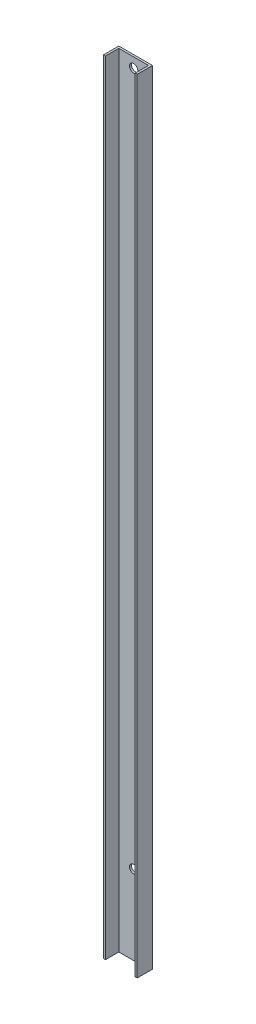
ISO-10303-21;
HEADER;
FILE_DESCRIPTION(('STEP AP214'),'2;1');
FILE_NAME('part.step','',(''),(''),'','','');
FILE_SCHEMA(('AUTOMOTIVE_DESIGN { 1 0 10303 214 1 1 1 1 }'));
ENDSEC;
DATA;
#1=APPLICATION_CONTEXT('core data for automotive mechanical design processes');
#2=APPLICATION_PROTOCOL_DEFINITION('international standard','automotive_design',2000,#1);
#3=PRODUCT_CONTEXT('',#1,'mechanical');
#4=PRODUCT('Part','Part','',(#3));
#5=PRODUCT_RELATED_PRODUCT_CATEGORY('part','',(#4));
#6=PRODUCT_DEFINITION_FORMATION('','',#4);
#7=PRODUCT_DEFINITION_CONTEXT('part definition',#1,'design');
#8=PRODUCT_DEFINITION('design','',#6,#7);
#9=PRODUCT_DEFINITION_SHAPE('','',#8);
#10=(LENGTH_UNIT() NAMED_UNIT(*) SI_UNIT(.MILLI.,.METRE.));
#11=(NAMED_UNIT(*) PLANE_ANGLE_UNIT() SI_UNIT($,.RADIAN.));
#12=(NAMED_UNIT(*) SI_UNIT($,.STERADIAN.) SOLID_ANGLE_UNIT());
#13=UNCERTAINTY_MEASURE_WITH_UNIT(LENGTH_MEASURE(1.E-05),#10,'distance_accuracy_value','');
#14=(GEOMETRIC_REPRESENTATION_CONTEXT(3) GLOBAL_UNCERTAINTY_ASSIGNED_CONTEXT((#13)) GLOBAL_UNIT_ASSIGNED_CONTEXT((#10,
#11,#12)) REPRESENTATION_CONTEXT('',''));
#15=CARTESIAN_POINT('',(0.,0.,0.));
#16=DIRECTION('',(0.,0.,1.));
#17=DIRECTION('',(1.,0.,0.));
#18=AXIS2_PLACEMENT_3D('',#15,#16,#17);
#19=CARTESIAN_POINT('',(5.05454545454545,430.,-7.7));
#20=DIRECTION('',(1.,0.,0.));
#21=DIRECTION('',(0.,0.,-1.));
#22=AXIS2_PLACEMENT_3D('',#19,#20,#21);
#23=PLANE('',#22);
#24=DIRECTION('',(0.,-1.,0.));
#25=VECTOR('',#24,1.);
#26=CARTESIAN_POINT('',(5.05454545454545,430.,0.));
#27=LINE('',#26,#25);
#28=CARTESIAN_POINT('',(5.05454545454545,395.,0.));
#29=VERTEX_POINT('',#28);
#30=CARTESIAN_POINT('',(5.05454545454545,0.,0.));
#31=VERTEX_POINT('',#30);
#32=EDGE_CURVE('E40',#29,#31,#27,.T.);
#33=ORIENTED_EDGE('',*,*,#32,.F.);
#34=DIRECTION('',(0.,0.,-1.));
#35=VECTOR('',#34,1.);
#36=CARTESIAN_POINT('',(5.05454545454545,395.,-7.7));
#37=LINE('',#36,#35);
#38=CARTESIAN_POINT('',(5.05454545454545,395.,-6.7));
#39=VERTEX_POINT('',#38);
#40=EDGE_CURVE('E105',#29,#39,#37,.T.);
#41=ORIENTED_EDGE('',*,*,#40,.T.);
#42=DIRECTION('',(0.,-1.,0.));
#43=VECTOR('',#42,1.);
#44=CARTESIAN_POINT('',(5.05454545454545,430.,-6.7));
#45=LINE('',#44,#43);
#46=CARTESIAN_POINT('',(5.05454545454545,0.,-6.7));
#47=VERTEX_POINT('',#46);
#48=EDGE_CURVE('E54',#39,#47,#45,.T.);
#49=ORIENTED_EDGE('',*,*,#48,.T.);
#50=DIRECTION('',(0.,0.,1.));
#51=VECTOR('',#50,1.);
#52=CARTESIAN_POINT('',(5.05454545454545,0.,-7.7));
#53=LINE('',#52,#51);
#54=EDGE_CURVE('E140',#47,#31,#53,.T.);
#55=ORIENTED_EDGE('',*,*,#54,.T.);
#56=EDGE_LOOP('',(#33,#41,#49,#55));
#57=FACE_BOUND('',#56,.T.);
#58=ADVANCED_FACE('F33',(#57),#23,.F.);
#59=CARTESIAN_POINT('',(6.05454545454545,430.,0.));
#60=DIRECTION('',(0.,0.,1.));
#61=DIRECTION('',(1.,0.,0.));
#62=AXIS2_PLACEMENT_3D('',#59,#60,#61);
#63=PLANE('',#62);
#64=DIRECTION('',(1.,0.,0.));
#65=VECTOR('',#64,1.);
#66=CARTESIAN_POINT('',(-18.7930909777879,395.,0.));
#67=LINE('',#66,#65);
#68=CARTESIAN_POINT('',(6.05454545454545,395.,0.));
#69=VERTEX_POINT('',#68);
#70=EDGE_CURVE('E114',#29,#69,#67,.T.);
#71=ORIENTED_EDGE('',*,*,#70,.F.);
#72=ORIENTED_EDGE('',*,*,#32,.T.);
#73=DIRECTION('',(-1.,0.,0.));
#74=VECTOR('',#73,1.);
#75=CARTESIAN_POINT('',(6.05454545454545,0.,0.));
#76=LINE('',#75,#74);
#77=CARTESIAN_POINT('',(6.05454545454545,0.,0.));
#78=VERTEX_POINT('',#77);
#79=EDGE_CURVE('E137',#78,#31,#76,.T.);
#80=ORIENTED_EDGE('',*,*,#79,.F.);
#81=DIRECTION('',(0.,-1.,0.));
#82=VECTOR('',#81,1.);
#83=CARTESIAN_POINT('',(6.05454545454545,430.,0.));
#84=LINE('',#83,#82);
#85=EDGE_CURVE('E129',#69,#78,#84,.T.);
#86=ORIENTED_EDGE('',*,*,#85,.F.);
#87=EDGE_LOOP('',(#71,#72,#80,#86));
#88=FACE_BOUND('',#87,.T.);
#89=ADVANCED_FACE('F134',(#88),#63,.T.);
#90=CARTESIAN_POINT('',(6.05454545454545,430.,-7.7));
#91=DIRECTION('',(1.,0.,0.));
#92=DIRECTION('',(0.,0.,-1.));
#93=AXIS2_PLACEMENT_3D('',#90,#91,#92);
#94=PLANE('',#93);
#95=DIRECTION('',(0.,0.,-1.));
#96=VECTOR('',#95,1.);
#97=CARTESIAN_POINT('',(6.05454545454545,395.,-7.7));
#98=LINE('',#97,#96);
#99=CARTESIAN_POINT('',(6.05454545454545,395.,-7.7));
#100=VERTEX_POINT('',#99);
#101=EDGE_CURVE('E177',#69,#100,#98,.T.);
#102=ORIENTED_EDGE('',*,*,#101,.F.);
#103=ORIENTED_EDGE('',*,*,#85,.T.);
#104=DIRECTION('',(0.,0.,1.));
#105=VECTOR('',#104,1.);
#106=CARTESIAN_POINT('',(6.05454545454545,0.,-7.7));
#107=LINE('',#106,#105);
#108=CARTESIAN_POINT('',(6.05454545454545,0.,-7.7));
#109=VERTEX_POINT('',#108);
#110=EDGE_CURVE('E148',#109,#78,#107,.T.);
#111=ORIENTED_EDGE('',*,*,#110,.F.);
#112=DIRECTION('',(0.,-1.,0.));
#113=VECTOR('',#112,1.);
#114=CARTESIAN_POINT('',(6.05454545454545,430.,-7.7));
#115=LINE('',#114,#113);
#116=EDGE_CURVE('E122',#100,#109,#115,.T.);
#117=ORIENTED_EDGE('',*,*,#116,.F.);
#118=EDGE_LOOP('',(#102,#103,#111,#117));
#119=FACE_BOUND('',#118,.T.);
#120=ADVANCED_FACE('F176',(#119),#94,.T.);
#121=CARTESIAN_POINT('',(-10.9454545454545,430.,-7.7));
#122=DIRECTION('',(0.,0.,-1.));
#123=DIRECTION('',(-1.,0.,0.));
#124=AXIS2_PLACEMENT_3D('',#121,#122,#123);
#125=PLANE('',#124);
#126=DIRECTION('',(-1.,0.,0.));
#127=VECTOR('',#126,1.);
#128=CARTESIAN_POINT('',(-10.9454545454545,395.,-7.7));
#129=LINE('',#128,#127);
#130=CARTESIAN_POINT('',(-10.9454545454545,395.,-7.7));
#131=VERTEX_POINT('',#130);
#132=EDGE_CURVE('E101',#100,#131,#129,.T.);
#133=ORIENTED_EDGE('',*,*,#132,.F.);
#134=ORIENTED_EDGE('',*,*,#116,.T.);
#135=DIRECTION('',(1.,0.,0.));
#136=VECTOR('',#135,1.);
#137=CARTESIAN_POINT('',(-10.9454545454545,0.,-7.7));
#138=LINE('',#137,#136);
#139=CARTESIAN_POINT('',(-10.9454545454545,0.,-7.7));
#140=VERTEX_POINT('',#139);
#141=EDGE_CURVE('E150',#140,#109,#138,.T.);
#142=ORIENTED_EDGE('',*,*,#141,.F.);
#143=DIRECTION('',(0.,-1.,0.));
#144=VECTOR('',#143,1.);
#145=CARTESIAN_POINT('',(-10.9454545454545,430.,-7.7));
#146=LINE('',#145,#144);
#147=EDGE_CURVE('E120',#131,#140,#146,.T.);
#148=ORIENTED_EDGE('',*,*,#147,.F.);
#149=EDGE_LOOP('',(#133,#134,#142,#148));
#150=FACE_BOUND('',#149,.T.);
#151=CARTESIAN_POINT('',(-2.44545454545446,39.9999999999999,-7.7));
#152=DIRECTION('',(0.,0.,-1.));
#153=DIRECTION('',(-1.,0.,0.));
#154=AXIS2_PLACEMENT_3D('',#151,#152,#153);
#155=CIRCLE('',#154,2.1);
#156=CARTESIAN_POINT('',(-4.54545454545446,39.9999999999999,-7.7));
#157=VERTEX_POINT('',#156);
#158=EDGE_CURVE('E181',#157,#157,#155,.T.);
#159=ORIENTED_EDGE('',*,*,#158,.F.);
#160=EDGE_LOOP('',(#159));
#161=FACE_BOUND('',#160,.T.);
#162=CARTESIAN_POINT('',(-2.44545454545455,390.,-7.7));
#163=DIRECTION('',(0.,0.,-1.));
#164=DIRECTION('',(-1.,0.,0.));
#165=AXIS2_PLACEMENT_3D('',#162,#163,#164);
#166=CIRCLE('',#165,2.1);
#167=CARTESIAN_POINT('',(-4.54545454545455,390.,-7.7));
#168=VERTEX_POINT('',#167);
#169=EDGE_CURVE('E143',#168,#168,#166,.T.);
#170=ORIENTED_EDGE('',*,*,#169,.F.);
#171=EDGE_LOOP('',(#170));
#172=FACE_BOUND('',#171,.T.);
#173=ADVANCED_FACE('F171',(#150,#161,#172),#125,.T.);
#174=CARTESIAN_POINT('',(-10.9454545454545,430.,0.));
#175=DIRECTION('',(-1.,0.,0.));
#176=DIRECTION('',(0.,0.,1.));
#177=AXIS2_PLACEMENT_3D('',#174,#175,#176);
#178=PLANE('',#177);
#179=DIRECTION('',(0.,0.,1.));
#180=VECTOR('',#179,1.);
#181=CARTESIAN_POINT('',(-10.9454545454545,395.,0.));
#182=LINE('',#181,#180);
#183=CARTESIAN_POINT('',(-10.9454545454545,395.,0.));
#184=VERTEX_POINT('',#183);
#185=EDGE_CURVE('E96',#131,#184,#182,.T.);
#186=ORIENTED_EDGE('',*,*,#185,.F.);
#187=ORIENTED_EDGE('',*,*,#147,.T.);
#188=DIRECTION('',(0.,0.,-1.));
#189=VECTOR('',#188,1.);
#190=CARTESIAN_POINT('',(-10.9454545454545,0.,0.));
#191=LINE('',#190,#189);
#192=CARTESIAN_POINT('',(-10.9454545454545,0.,0.));
#193=VERTEX_POINT('',#192);
#194=EDGE_CURVE('E118',#193,#140,#191,.T.);
#195=ORIENTED_EDGE('',*,*,#194,.F.);
#196=DIRECTION('',(0.,-1.,0.));
#197=VECTOR('',#196,1.);
#198=CARTESIAN_POINT('',(-10.9454545454545,430.,0.));
#199=LINE('',#198,#197);
#200=EDGE_CURVE('E111',#184,#193,#199,.T.);
#201=ORIENTED_EDGE('',*,*,#200,.F.);
#202=EDGE_LOOP('',(#186,#187,#195,#201));
#203=FACE_BOUND('',#202,.T.);
#204=ADVANCED_FACE('F116',(#203),#178,.T.);
#205=CARTESIAN_POINT('',(-9.94545454545455,430.,0.));
#206=DIRECTION('',(0.,0.,1.));
#207=DIRECTION('',(1.,0.,0.));
#208=AXIS2_PLACEMENT_3D('',#205,#206,#207);
#209=PLANE('',#208);
#210=CARTESIAN_POINT('',(-9.94545454545455,395.,0.));
#211=VERTEX_POINT('',#210);
#212=EDGE_CURVE('E99',#184,#211,#67,.T.);
#213=ORIENTED_EDGE('',*,*,#212,.F.);
#214=ORIENTED_EDGE('',*,*,#200,.T.);
#215=DIRECTION('',(-1.,0.,0.));
#216=VECTOR('',#215,1.);
#217=CARTESIAN_POINT('',(-9.94545454545455,0.,0.));
#218=LINE('',#217,#216);
#219=CARTESIAN_POINT('',(-9.94545454545455,0.,0.));
#220=VERTEX_POINT('',#219);
#221=EDGE_CURVE('E156',#220,#193,#218,.T.);
#222=ORIENTED_EDGE('',*,*,#221,.F.);
#223=DIRECTION('',(0.,-1.,0.));
#224=VECTOR('',#223,1.);
#225=CARTESIAN_POINT('',(-9.94545454545455,430.,0.));
#226=LINE('',#225,#224);
#227=EDGE_CURVE('E113',#211,#220,#226,.T.);
#228=ORIENTED_EDGE('',*,*,#227,.F.);
#229=EDGE_LOOP('',(#213,#214,#222,#228));
#230=FACE_BOUND('',#229,.T.);
#231=ADVANCED_FACE('F109',(#230),#209,.T.);
#232=CARTESIAN_POINT('',(-9.94545454545455,430.,0.));
#233=DIRECTION('',(-1.,0.,0.));
#234=DIRECTION('',(0.,0.,1.));
#235=AXIS2_PLACEMENT_3D('',#232,#233,#234);
#236=PLANE('',#235);
#237=DIRECTION('',(0.,-1.,0.));
#238=VECTOR('',#237,1.);
#239=CARTESIAN_POINT('',(-9.94545454545455,430.,-6.7));
#240=LINE('',#239,#238);
#241=CARTESIAN_POINT('',(-9.94545454545455,395.,-6.7));
#242=VERTEX_POINT('',#241);
#243=CARTESIAN_POINT('',(-9.94545454545455,0.,-6.7));
#244=VERTEX_POINT('',#243);
#245=EDGE_CURVE('E124',#242,#244,#240,.T.);
#246=ORIENTED_EDGE('',*,*,#245,.F.);
#247=DIRECTION('',(0.,0.,1.));
#248=VECTOR('',#247,1.);
#249=CARTESIAN_POINT('',(-9.94545454545455,395.,0.));
#250=LINE('',#249,#248);
#251=EDGE_CURVE('E47',#242,#211,#250,.T.);
#252=ORIENTED_EDGE('',*,*,#251,.T.);
#253=ORIENTED_EDGE('',*,*,#227,.T.);
#254=DIRECTION('',(0.,0.,-1.));
#255=VECTOR('',#254,1.);
#256=CARTESIAN_POINT('',(-9.94545454545455,0.,0.));
#257=LINE('',#256,#255);
#258=EDGE_CURVE('E158',#220,#244,#257,.T.);
#259=ORIENTED_EDGE('',*,*,#258,.T.);
#260=EDGE_LOOP('',(#246,#252,#253,#259));
#261=FACE_BOUND('',#260,.T.);
#262=ADVANCED_FACE('F168',(#261),#236,.F.);
#263=CARTESIAN_POINT('',(-10.9454545454545,430.,-6.7));
#264=DIRECTION('',(0.,0.,-1.));
#265=DIRECTION('',(-1.,0.,0.));
#266=AXIS2_PLACEMENT_3D('',#263,#264,#265);
#267=PLANE('',#266);
#268=CARTESIAN_POINT('',(-2.44545454545446,39.9999999999999,-6.7));
#269=DIRECTION('',(0.,0.,1.));
#270=DIRECTION('',(-1.,0.,0.));
#271=AXIS2_PLACEMENT_3D('',#268,#269,#270);
#272=CIRCLE('',#271,2.1);
#273=CARTESIAN_POINT('',(-4.54545454545446,39.9999999999999,-6.7));
#274=VERTEX_POINT('',#273);
#275=EDGE_CURVE('E178',#274,#274,#272,.T.);
#276=ORIENTED_EDGE('',*,*,#275,.F.);
#277=EDGE_LOOP('',(#276));
#278=FACE_BOUND('',#277,.T.);
#279=CARTESIAN_POINT('',(-2.44545454545455,390.,-6.7));
#280=DIRECTION('',(0.,0.,1.));
#281=DIRECTION('',(1.,0.,0.));
#282=AXIS2_PLACEMENT_3D('',#279,#280,#281);
#283=CIRCLE('',#282,2.1);
#284=CARTESIAN_POINT('',(-0.345454545454551,390.,-6.7));
#285=VERTEX_POINT('',#284);
#286=EDGE_CURVE('E187',#285,#285,#283,.T.);
#287=ORIENTED_EDGE('',*,*,#286,.F.);
#288=EDGE_LOOP('',(#287));
#289=FACE_BOUND('',#288,.T.);
#290=ORIENTED_EDGE('',*,*,#48,.F.);
#291=DIRECTION('',(-1.,0.,0.));
#292=VECTOR('',#291,1.);
#293=CARTESIAN_POINT('',(-10.9454545454545,395.,-6.7));
#294=LINE('',#293,#292);
#295=EDGE_CURVE('E11',#39,#242,#294,.T.);
#296=ORIENTED_EDGE('',*,*,#295,.T.);
#297=ORIENTED_EDGE('',*,*,#245,.T.);
#298=DIRECTION('',(1.,0.,0.));
#299=VECTOR('',#298,1.);
#300=CARTESIAN_POINT('',(-10.9454545454545,0.,-6.7));
#301=LINE('',#300,#299);
#302=EDGE_CURVE('E161',#244,#47,#301,.T.);
#303=ORIENTED_EDGE('',*,*,#302,.T.);
#304=EDGE_LOOP('',(#290,#296,#297,#303));
#305=FACE_BOUND('',#304,.T.);
#306=ADVANCED_FACE('F165',(#278,#289,#305),#267,.F.);
#307=CARTESIAN_POINT('',(0.,0.,0.));
#308=DIRECTION('',(0.,-1.,0.));
#309=DIRECTION('',(-1.,0.,0.));
#310=AXIS2_PLACEMENT_3D('',#307,#308,#309);
#311=PLANE('',#310);
#312=ORIENTED_EDGE('',*,*,#54,.F.);
#313=ORIENTED_EDGE('',*,*,#302,.F.);
#314=ORIENTED_EDGE('',*,*,#258,.F.);
#315=ORIENTED_EDGE('',*,*,#221,.T.);
#316=ORIENTED_EDGE('',*,*,#194,.T.);
#317=ORIENTED_EDGE('',*,*,#141,.T.);
#318=ORIENTED_EDGE('',*,*,#110,.T.);
#319=ORIENTED_EDGE('',*,*,#79,.T.);
#320=EDGE_LOOP('',(#312,#313,#314,#315,#316,#317,#318,#319));
#321=FACE_BOUND('',#320,.T.);
#322=ADVANCED_FACE('F145',(#321),#311,.T.);
#323=CARTESIAN_POINT('',(-2.44545454545455,390.,-16.7));
#324=DIRECTION('',(0.,0.,1.));
#325=DIRECTION('',(1.,0.,0.));
#326=AXIS2_PLACEMENT_3D('',#323,#324,#325);
#327=CYLINDRICAL_SURFACE('',#326,2.1);
#328=ORIENTED_EDGE('',*,*,#169,.T.);
#329=EDGE_LOOP('',(#328));
#330=FACE_BOUND('',#329,.T.);
#331=ORIENTED_EDGE('',*,*,#286,.T.);
#332=EDGE_LOOP('',(#331));
#333=FACE_BOUND('',#332,.T.);
#334=ADVANCED_FACE('F192',(#330,#333),#327,.F.);
#335=CARTESIAN_POINT('',(-2.44545454545446,39.9999999999999,-16.7));
#336=DIRECTION('',(0.,0.,1.));
#337=DIRECTION('',(1.,0.,0.));
#338=AXIS2_PLACEMENT_3D('',#335,#336,#337);
#339=CYLINDRICAL_SURFACE('',#338,2.1);
#340=ORIENTED_EDGE('',*,*,#158,.T.);
#341=EDGE_LOOP('',(#340));
#342=FACE_BOUND('',#341,.T.);
#343=ORIENTED_EDGE('',*,*,#275,.T.);
#344=EDGE_LOOP('',(#343));
#345=FACE_BOUND('',#344,.T.);
#346=ADVANCED_FACE('F264',(#342,#345),#339,.F.);
#347=CARTESIAN_POINT('',(-18.7930909777879,395.,-10.));
#348=DIRECTION('',(0.,-1.,0.));
#349=DIRECTION('',(0.,0.,-1.));
#350=AXIS2_PLACEMENT_3D('',#347,#348,#349);
#351=PLANE('',#350);
#352=ORIENTED_EDGE('',*,*,#101,.T.);
#353=ORIENTED_EDGE('',*,*,#132,.T.);
#354=ORIENTED_EDGE('',*,*,#185,.T.);
#355=ORIENTED_EDGE('',*,*,#212,.T.);
#356=ORIENTED_EDGE('',*,*,#251,.F.);
#357=ORIENTED_EDGE('',*,*,#295,.F.);
#358=ORIENTED_EDGE('',*,*,#40,.F.);
#359=ORIENTED_EDGE('',*,*,#70,.T.);
#360=EDGE_LOOP('',(#352,#353,#354,#355,#356,#357,#358,#359));
#361=FACE_BOUND('',#360,.T.);
#362=ADVANCED_FACE('F98',(#361),#351,.F.);
#363=CLOSED_SHELL('',(#58,#89,#120,#173,#204,#231,#262,#306,#322,#334,#346,#362));
#364=MANIFOLD_SOLID_BREP('B2',#363);
#365=ADVANCED_BREP_SHAPE_REPRESENTATION('',(#18,#364),#14);
#366=SHAPE_DEFINITION_REPRESENTATION(#9,#365);
ENDSEC;
END-ISO-10303-21;
